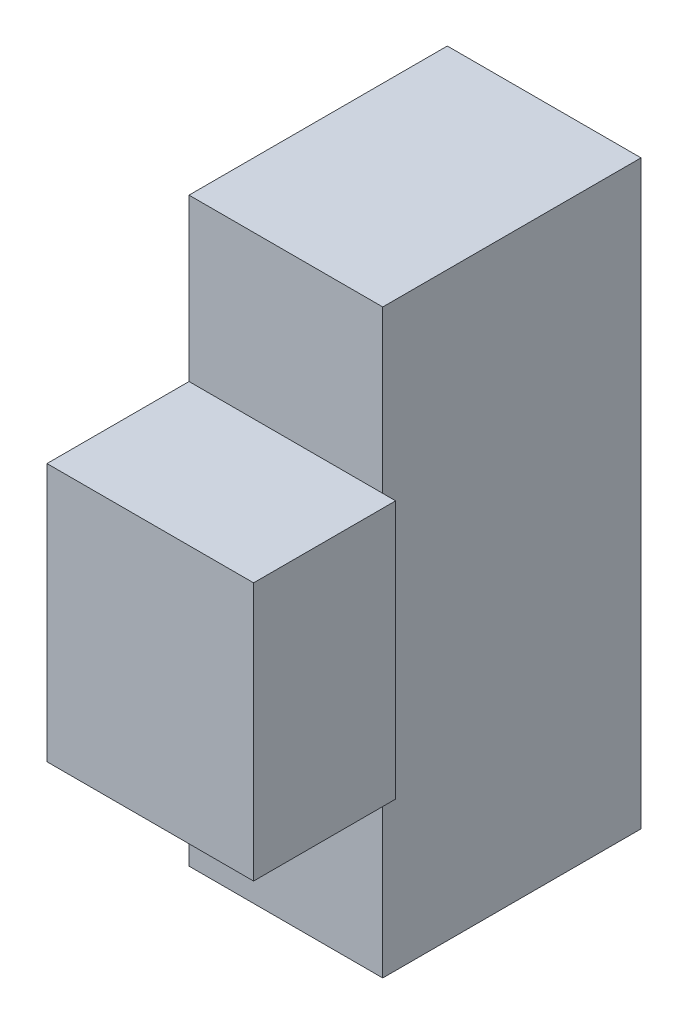
ISO-10303-21;
HEADER;
FILE_DESCRIPTION(('STEP AP214'),'2;1');
FILE_NAME('part.step','',(''),(''),'','','');
FILE_SCHEMA(('AUTOMOTIVE_DESIGN { 1 0 10303 214 1 1 1 1 }'));
ENDSEC;
DATA;
#1=APPLICATION_CONTEXT('core data for automotive mechanical design processes');
#2=APPLICATION_PROTOCOL_DEFINITION('international standard','automotive_design',2000,#1);
#3=PRODUCT_CONTEXT('',#1,'mechanical');
#4=PRODUCT('Part','Part','',(#3));
#5=PRODUCT_RELATED_PRODUCT_CATEGORY('part','',(#4));
#6=PRODUCT_DEFINITION_FORMATION('','',#4);
#7=PRODUCT_DEFINITION_CONTEXT('part definition',#1,'design');
#8=PRODUCT_DEFINITION('design','',#6,#7);
#9=PRODUCT_DEFINITION_SHAPE('','',#8);
#10=(LENGTH_UNIT() NAMED_UNIT(*) SI_UNIT(.MILLI.,.METRE.));
#11=(NAMED_UNIT(*) PLANE_ANGLE_UNIT() SI_UNIT($,.RADIAN.));
#12=(NAMED_UNIT(*) SI_UNIT($,.STERADIAN.) SOLID_ANGLE_UNIT());
#13=UNCERTAINTY_MEASURE_WITH_UNIT(LENGTH_MEASURE(1.E-05),#10,'distance_accuracy_value','');
#14=(GEOMETRIC_REPRESENTATION_CONTEXT(3) GLOBAL_UNCERTAINTY_ASSIGNED_CONTEXT((#13)) GLOBAL_UNIT_ASSIGNED_CONTEXT((#10,
#11,#12)) REPRESENTATION_CONTEXT('',''));
#15=CARTESIAN_POINT('',(0.,0.,0.));
#16=DIRECTION('',(0.,0.,1.));
#17=DIRECTION('',(1.,0.,0.));
#18=AXIS2_PLACEMENT_3D('',#15,#16,#17);
#19=CARTESIAN_POINT('',(0.,0.,0.));
#20=DIRECTION('',(1.,0.,0.));
#21=DIRECTION('',(0.,0.,-1.));
#22=AXIS2_PLACEMENT_3D('',#19,#20,#21);
#23=PLANE('',#22);
#24=DIRECTION('',(0.,0.,-1.));
#25=VECTOR('',#24,1.);
#26=CARTESIAN_POINT('',(0.,-22.5,20.));
#27=LINE('',#26,#25);
#28=CARTESIAN_POINT('',(0.,-22.5,20.));
#29=VERTEX_POINT('',#28);
#30=CARTESIAN_POINT('',(0.,-22.5,0.));
#31=VERTEX_POINT('',#30);
#32=EDGE_CURVE('E187',#29,#31,#27,.T.);
#33=ORIENTED_EDGE('',*,*,#32,.F.);
#34=DIRECTION('',(0.,-1.,0.));
#35=VECTOR('',#34,1.);
#36=CARTESIAN_POINT('',(0.,22.5,20.));
#37=LINE('',#36,#35);
#38=CARTESIAN_POINT('',(0.,-9.99999999999999,20.));
#39=VERTEX_POINT('',#38);
#40=EDGE_CURVE('E208',#39,#29,#37,.T.);
#41=ORIENTED_EDGE('',*,*,#40,.F.);
#42=DIRECTION('',(0.,0.,-1.));
#43=VECTOR('',#42,1.);
#44=CARTESIAN_POINT('',(0.,-10.,31.));
#45=LINE('',#44,#43);
#46=CARTESIAN_POINT('',(0.,-10.,31.));
#47=VERTEX_POINT('',#46);
#48=EDGE_CURVE('E65',#47,#39,#45,.T.);
#49=ORIENTED_EDGE('',*,*,#48,.F.);
#50=DIRECTION('',(0.,-1.,0.));
#51=VECTOR('',#50,1.);
#52=CARTESIAN_POINT('',(0.,10.,31.));
#53=LINE('',#52,#51);
#54=CARTESIAN_POINT('',(0.,10.,31.));
#55=VERTEX_POINT('',#54);
#56=EDGE_CURVE('E161',#55,#47,#53,.T.);
#57=ORIENTED_EDGE('',*,*,#56,.F.);
#58=DIRECTION('',(0.,0.,1.));
#59=VECTOR('',#58,1.);
#60=CARTESIAN_POINT('',(0.,10.,20.));
#61=LINE('',#60,#59);
#62=CARTESIAN_POINT('',(0.,10.,20.));
#63=VERTEX_POINT('',#62);
#64=EDGE_CURVE('E157',#63,#55,#61,.T.);
#65=ORIENTED_EDGE('',*,*,#64,.F.);
#66=CARTESIAN_POINT('',(0.,22.5,20.));
#67=VERTEX_POINT('',#66);
#68=EDGE_CURVE('E192',#67,#63,#37,.T.);
#69=ORIENTED_EDGE('',*,*,#68,.F.);
#70=DIRECTION('',(0.,0.,1.));
#71=VECTOR('',#70,1.);
#72=CARTESIAN_POINT('',(0.,22.5,0.));
#73=LINE('',#72,#71);
#74=CARTESIAN_POINT('',(0.,22.5,0.));
#75=VERTEX_POINT('',#74);
#76=EDGE_CURVE('E206',#75,#67,#73,.T.);
#77=ORIENTED_EDGE('',*,*,#76,.F.);
#78=DIRECTION('',(0.,1.,0.));
#79=VECTOR('',#78,1.);
#80=CARTESIAN_POINT('',(0.,-22.5,0.));
#81=LINE('',#80,#79);
#82=EDGE_CURVE('E204',#31,#75,#81,.T.);
#83=ORIENTED_EDGE('',*,*,#82,.F.);
#84=EDGE_LOOP('',(#33,#41,#49,#57,#65,#69,#77,#83));
#85=FACE_BOUND('',#84,.T.);
#86=CARTESIAN_POINT('',(0.,-13.1,9.99999999999998));
#87=DIRECTION('',(1.,0.,0.));
#88=DIRECTION('',(0.,0.,-1.));
#89=AXIS2_PLACEMENT_3D('',#86,#87,#88);
#90=CIRCLE('',#89,7.9);
#91=CARTESIAN_POINT('',(0.,-13.1,17.9));
#92=VERTEX_POINT('',#91);
#93=CARTESIAN_POINT('',(0.,-13.1,2.09999999999998));
#94=VERTEX_POINT('',#93);
#95=EDGE_CURVE('E57',#92,#94,#90,.T.);
#96=ORIENTED_EDGE('',*,*,#95,.T.);
#97=DIRECTION('',(0.,1.,0.));
#98=VECTOR('',#97,1.);
#99=CARTESIAN_POINT('',(0.,-13.1,2.09999999999998));
#100=LINE('',#99,#98);
#101=CARTESIAN_POINT('',(0.,13.1,2.09999999999998));
#102=VERTEX_POINT('',#101);
#103=EDGE_CURVE('E156',#94,#102,#100,.T.);
#104=ORIENTED_EDGE('',*,*,#103,.T.);
#105=CARTESIAN_POINT('',(0.,13.1,9.99999999999998));
#106=DIRECTION('',(1.,0.,0.));
#107=DIRECTION('',(0.,0.,-1.));
#108=AXIS2_PLACEMENT_3D('',#105,#106,#107);
#109=CIRCLE('',#108,7.9);
#110=CARTESIAN_POINT('',(0.,13.1,17.9));
#111=VERTEX_POINT('',#110);
#112=EDGE_CURVE('E406',#102,#111,#109,.T.);
#113=ORIENTED_EDGE('',*,*,#112,.T.);
#114=DIRECTION('',(0.,-1.,0.));
#115=VECTOR('',#114,1.);
#116=CARTESIAN_POINT('',(0.,13.1,17.9));
#117=LINE('',#116,#115);
#118=EDGE_CURVE('E152',#111,#92,#117,.T.);
#119=ORIENTED_EDGE('',*,*,#118,.T.);
#120=EDGE_LOOP('',(#96,#104,#113,#119));
#121=FACE_BOUND('',#120,.T.);
#122=ADVANCED_FACE('F39',(#85,#121),#23,.F.);
#123=CARTESIAN_POINT('',(15.,22.5,20.));
#124=DIRECTION('',(0.,0.,-1.));
#125=DIRECTION('',(-1.,0.,0.));
#126=AXIS2_PLACEMENT_3D('',#123,#124,#125);
#127=PLANE('',#126);
#128=DIRECTION('',(-1.,0.,0.));
#129=VECTOR('',#128,1.);
#130=CARTESIAN_POINT('',(16.,10.,20.));
#131=LINE('',#130,#129);
#132=CARTESIAN_POINT('',(15.,10.,20.));
#133=VERTEX_POINT('',#132);
#134=EDGE_CURVE('E11',#133,#63,#131,.T.);
#135=ORIENTED_EDGE('',*,*,#134,.F.);
#136=DIRECTION('',(0.,-1.,0.));
#137=VECTOR('',#136,1.);
#138=CARTESIAN_POINT('',(15.,22.5,20.));
#139=LINE('',#138,#137);
#140=CARTESIAN_POINT('',(15.,22.5,20.));
#141=VERTEX_POINT('',#140);
#142=EDGE_CURVE('E197',#141,#133,#139,.T.);
#143=ORIENTED_EDGE('',*,*,#142,.F.);
#144=DIRECTION('',(-1.,0.,0.));
#145=VECTOR('',#144,1.);
#146=CARTESIAN_POINT('',(15.,22.5,20.));
#147=LINE('',#146,#145);
#148=EDGE_CURVE('E213',#141,#67,#147,.T.);
#149=ORIENTED_EDGE('',*,*,#148,.T.);
#150=ORIENTED_EDGE('',*,*,#68,.T.);
#151=EDGE_LOOP('',(#135,#143,#149,#150));
#152=FACE_BOUND('',#151,.T.);
#153=ADVANCED_FACE('F250',(#152),#127,.F.);
#154=CARTESIAN_POINT('',(15.,-22.5,20.));
#155=DIRECTION('',(0.,1.,0.));
#156=DIRECTION('',(0.,0.,1.));
#157=AXIS2_PLACEMENT_3D('',#154,#155,#156);
#158=PLANE('',#157);
#159=ORIENTED_EDGE('',*,*,#32,.T.);
#160=DIRECTION('',(-1.,0.,0.));
#161=VECTOR('',#160,1.);
#162=CARTESIAN_POINT('',(15.,-22.5,0.));
#163=LINE('',#162,#161);
#164=CARTESIAN_POINT('',(15.,-22.5,0.));
#165=VERTEX_POINT('',#164);
#166=EDGE_CURVE('E43',#165,#31,#163,.T.);
#167=ORIENTED_EDGE('',*,*,#166,.F.);
#168=DIRECTION('',(0.,0.,-1.));
#169=VECTOR('',#168,1.);
#170=CARTESIAN_POINT('',(15.,-22.5,20.));
#171=LINE('',#170,#169);
#172=CARTESIAN_POINT('',(15.,-22.5,20.));
#173=VERTEX_POINT('',#172);
#174=EDGE_CURVE('E188',#173,#165,#171,.T.);
#175=ORIENTED_EDGE('',*,*,#174,.F.);
#176=DIRECTION('',(-1.,0.,0.));
#177=VECTOR('',#176,1.);
#178=CARTESIAN_POINT('',(15.,-22.5,20.));
#179=LINE('',#178,#177);
#180=EDGE_CURVE('E200',#173,#29,#179,.T.);
#181=ORIENTED_EDGE('',*,*,#180,.T.);
#182=EDGE_LOOP('',(#159,#167,#175,#181));
#183=FACE_BOUND('',#182,.T.);
#184=ADVANCED_FACE('F41',(#183),#158,.F.);
#185=CARTESIAN_POINT('',(15.,-22.5,0.));
#186=DIRECTION('',(0.,0.,1.));
#187=DIRECTION('',(0.,-1.,0.));
#188=AXIS2_PLACEMENT_3D('',#185,#186,#187);
#189=PLANE('',#188);
#190=ORIENTED_EDGE('',*,*,#82,.T.);
#191=DIRECTION('',(-1.,0.,0.));
#192=VECTOR('',#191,1.);
#193=CARTESIAN_POINT('',(15.,22.5,0.));
#194=LINE('',#193,#192);
#195=CARTESIAN_POINT('',(15.,22.5,0.));
#196=VERTEX_POINT('',#195);
#197=EDGE_CURVE('E215',#196,#75,#194,.T.);
#198=ORIENTED_EDGE('',*,*,#197,.F.);
#199=DIRECTION('',(0.,1.,0.));
#200=VECTOR('',#199,1.);
#201=CARTESIAN_POINT('',(15.,-22.5,0.));
#202=LINE('',#201,#200);
#203=EDGE_CURVE('E191',#165,#196,#202,.T.);
#204=ORIENTED_EDGE('',*,*,#203,.F.);
#205=ORIENTED_EDGE('',*,*,#166,.T.);
#206=EDGE_LOOP('',(#190,#198,#204,#205));
#207=FACE_BOUND('',#206,.T.);
#208=ADVANCED_FACE('F282',(#207),#189,.F.);
#209=CARTESIAN_POINT('',(15.,22.5,0.));
#210=DIRECTION('',(0.,-1.,0.));
#211=DIRECTION('',(0.,0.,-1.));
#212=AXIS2_PLACEMENT_3D('',#209,#210,#211);
#213=PLANE('',#212);
#214=ORIENTED_EDGE('',*,*,#76,.T.);
#215=ORIENTED_EDGE('',*,*,#148,.F.);
#216=DIRECTION('',(0.,0.,1.));
#217=VECTOR('',#216,1.);
#218=CARTESIAN_POINT('',(15.,22.5,0.));
#219=LINE('',#218,#217);
#220=EDGE_CURVE('E194',#196,#141,#219,.T.);
#221=ORIENTED_EDGE('',*,*,#220,.F.);
#222=ORIENTED_EDGE('',*,*,#197,.T.);
#223=EDGE_LOOP('',(#214,#215,#221,#222));
#224=FACE_BOUND('',#223,.T.);
#225=ADVANCED_FACE('F280',(#224),#213,.F.);
#226=CARTESIAN_POINT('',(15.,-10.,20.));
#227=VERTEX_POINT('',#226);
#228=EDGE_CURVE('E196',#227,#173,#139,.T.);
#229=ORIENTED_EDGE('',*,*,#228,.F.);
#230=DIRECTION('',(-1.,0.,0.));
#231=VECTOR('',#230,1.);
#232=CARTESIAN_POINT('',(16.,-10.,20.));
#233=LINE('',#232,#231);
#234=EDGE_CURVE('E48',#227,#39,#233,.T.);
#235=ORIENTED_EDGE('',*,*,#234,.T.);
#236=ORIENTED_EDGE('',*,*,#40,.T.);
#237=ORIENTED_EDGE('',*,*,#180,.F.);
#238=EDGE_LOOP('',(#229,#235,#236,#237));
#239=FACE_BOUND('',#238,.T.);
#240=ADVANCED_FACE('F227',(#239),#127,.F.);
#241=CARTESIAN_POINT('',(15.,0.,0.));
#242=DIRECTION('',(1.,0.,0.));
#243=DIRECTION('',(0.,0.,-1.));
#244=AXIS2_PLACEMENT_3D('',#241,#242,#243);
#245=PLANE('',#244);
#246=ORIENTED_EDGE('',*,*,#174,.T.);
#247=ORIENTED_EDGE('',*,*,#203,.T.);
#248=ORIENTED_EDGE('',*,*,#220,.T.);
#249=ORIENTED_EDGE('',*,*,#142,.T.);
#250=EDGE_CURVE('E201',#133,#227,#139,.T.);
#251=ORIENTED_EDGE('',*,*,#250,.T.);
#252=ORIENTED_EDGE('',*,*,#228,.T.);
#253=EDGE_LOOP('',(#246,#247,#248,#249,#251,#252));
#254=FACE_BOUND('',#253,.T.);
#255=ADVANCED_FACE('F237',(#254),#245,.T.);
#256=CARTESIAN_POINT('',(16.,10.,20.));
#257=DIRECTION('',(0.,-1.,0.));
#258=DIRECTION('',(0.,0.,-1.));
#259=AXIS2_PLACEMENT_3D('',#256,#257,#258);
#260=PLANE('',#259);
#261=ORIENTED_EDGE('',*,*,#64,.T.);
#262=DIRECTION('',(-1.,0.,0.));
#263=VECTOR('',#262,1.);
#264=CARTESIAN_POINT('',(16.,10.,31.));
#265=LINE('',#264,#263);
#266=CARTESIAN_POINT('',(16.,10.,31.));
#267=VERTEX_POINT('',#266);
#268=EDGE_CURVE('E184',#267,#55,#265,.T.);
#269=ORIENTED_EDGE('',*,*,#268,.F.);
#270=DIRECTION('',(0.,0.,1.));
#271=VECTOR('',#270,1.);
#272=CARTESIAN_POINT('',(16.,10.,20.));
#273=LINE('',#272,#271);
#274=CARTESIAN_POINT('',(16.,10.,20.));
#275=VERTEX_POINT('',#274);
#276=EDGE_CURVE('E167',#275,#267,#273,.T.);
#277=ORIENTED_EDGE('',*,*,#276,.F.);
#278=EDGE_CURVE('E50',#275,#133,#131,.T.);
#279=ORIENTED_EDGE('',*,*,#278,.T.);
#280=ORIENTED_EDGE('',*,*,#134,.T.);
#281=EDGE_LOOP('',(#261,#269,#277,#279,#280));
#282=FACE_BOUND('',#281,.T.);
#283=ADVANCED_FACE('F246',(#282),#260,.F.);
#284=CARTESIAN_POINT('',(16.,10.,31.));
#285=DIRECTION('',(0.,0.,-1.));
#286=DIRECTION('',(-1.,0.,0.));
#287=AXIS2_PLACEMENT_3D('',#284,#285,#286);
#288=PLANE('',#287);
#289=ORIENTED_EDGE('',*,*,#56,.T.);
#290=DIRECTION('',(-1.,0.,0.));
#291=VECTOR('',#290,1.);
#292=CARTESIAN_POINT('',(16.,-10.,31.));
#293=LINE('',#292,#291);
#294=CARTESIAN_POINT('',(16.,-10.,31.));
#295=VERTEX_POINT('',#294);
#296=EDGE_CURVE('E182',#295,#47,#293,.T.);
#297=ORIENTED_EDGE('',*,*,#296,.F.);
#298=DIRECTION('',(0.,-1.,0.));
#299=VECTOR('',#298,1.);
#300=CARTESIAN_POINT('',(16.,10.,31.));
#301=LINE('',#300,#299);
#302=EDGE_CURVE('E170',#267,#295,#301,.T.);
#303=ORIENTED_EDGE('',*,*,#302,.F.);
#304=ORIENTED_EDGE('',*,*,#268,.T.);
#305=EDGE_LOOP('',(#289,#297,#303,#304));
#306=FACE_BOUND('',#305,.T.);
#307=ADVANCED_FACE('F254',(#306),#288,.F.);
#308=CARTESIAN_POINT('',(16.,-10.,31.));
#309=DIRECTION('',(0.,1.,0.));
#310=DIRECTION('',(0.,0.,1.));
#311=AXIS2_PLACEMENT_3D('',#308,#309,#310);
#312=PLANE('',#311);
#313=ORIENTED_EDGE('',*,*,#48,.T.);
#314=ORIENTED_EDGE('',*,*,#234,.F.);
#315=CARTESIAN_POINT('',(16.,-10.,20.));
#316=VERTEX_POINT('',#315);
#317=EDGE_CURVE('E179',#316,#227,#233,.T.);
#318=ORIENTED_EDGE('',*,*,#317,.F.);
#319=DIRECTION('',(0.,0.,-1.));
#320=VECTOR('',#319,1.);
#321=CARTESIAN_POINT('',(16.,-10.,31.));
#322=LINE('',#321,#320);
#323=EDGE_CURVE('E172',#295,#316,#322,.T.);
#324=ORIENTED_EDGE('',*,*,#323,.F.);
#325=ORIENTED_EDGE('',*,*,#296,.T.);
#326=EDGE_LOOP('',(#313,#314,#318,#324,#325));
#327=FACE_BOUND('',#326,.T.);
#328=ADVANCED_FACE('F259',(#327),#312,.F.);
#329=CARTESIAN_POINT('',(16.,-10.,20.));
#330=DIRECTION('',(0.,0.,1.));
#331=DIRECTION('',(1.,0.,0.));
#332=AXIS2_PLACEMENT_3D('',#329,#330,#331);
#333=PLANE('',#332);
#334=ORIENTED_EDGE('',*,*,#250,.F.);
#335=ORIENTED_EDGE('',*,*,#278,.F.);
#336=DIRECTION('',(0.,1.,0.));
#337=VECTOR('',#336,1.);
#338=CARTESIAN_POINT('',(16.,-10.,20.));
#339=LINE('',#338,#337);
#340=EDGE_CURVE('E174',#316,#275,#339,.T.);
#341=ORIENTED_EDGE('',*,*,#340,.F.);
#342=ORIENTED_EDGE('',*,*,#317,.T.);
#343=EDGE_LOOP('',(#334,#335,#341,#342));
#344=FACE_BOUND('',#343,.T.);
#345=ADVANCED_FACE('F241',(#344),#333,.F.);
#346=CARTESIAN_POINT('',(16.,0.,0.));
#347=DIRECTION('',(1.,0.,0.));
#348=DIRECTION('',(0.,0.,-1.));
#349=AXIS2_PLACEMENT_3D('',#346,#347,#348);
#350=PLANE('',#349);
#351=ORIENTED_EDGE('',*,*,#276,.T.);
#352=ORIENTED_EDGE('',*,*,#302,.T.);
#353=ORIENTED_EDGE('',*,*,#323,.T.);
#354=ORIENTED_EDGE('',*,*,#340,.T.);
#355=EDGE_LOOP('',(#351,#352,#353,#354));
#356=FACE_BOUND('',#355,.T.);
#357=ADVANCED_FACE('F258',(#356),#350,.T.);
#358=CARTESIAN_POINT('',(11.4,-13.1,9.99999999999998));
#359=DIRECTION('',(-1.,0.,0.));
#360=DIRECTION('',(0.,0.,1.));
#361=AXIS2_PLACEMENT_3D('',#358,#359,#360);
#362=CYLINDRICAL_SURFACE('',#361,7.9);
#363=ORIENTED_EDGE('',*,*,#95,.F.);
#364=DIRECTION('',(-1.,0.,0.));
#365=VECTOR('',#364,1.);
#366=CARTESIAN_POINT('',(11.4,-13.1,17.9));
#367=LINE('',#366,#365);
#368=CARTESIAN_POINT('',(11.4,-13.1,17.9));
#369=VERTEX_POINT('',#368);
#370=EDGE_CURVE('E151',#369,#92,#367,.T.);
#371=ORIENTED_EDGE('',*,*,#370,.F.);
#372=CARTESIAN_POINT('',(11.4,-13.1,9.99999999999998));
#373=DIRECTION('',(1.,0.,0.));
#374=DIRECTION('',(0.,0.,-1.));
#375=AXIS2_PLACEMENT_3D('',#372,#373,#374);
#376=CIRCLE('',#375,7.9);
#377=CARTESIAN_POINT('',(11.4,-13.1,2.09999999999998));
#378=VERTEX_POINT('',#377);
#379=EDGE_CURVE('E143',#369,#378,#376,.T.);
#380=ORIENTED_EDGE('',*,*,#379,.T.);
#381=DIRECTION('',(-1.,0.,0.));
#382=VECTOR('',#381,1.);
#383=CARTESIAN_POINT('',(11.4,-13.1,2.09999999999998));
#384=LINE('',#383,#382);
#385=EDGE_CURVE('E150',#378,#94,#384,.T.);
#386=ORIENTED_EDGE('',*,*,#385,.T.);
#387=EDGE_LOOP('',(#363,#371,#380,#386));
#388=FACE_BOUND('',#387,.T.);
#389=ADVANCED_FACE('F149',(#388),#362,.F.);
#390=CARTESIAN_POINT('',(11.4,-13.1,2.09999999999998));
#391=DIRECTION('',(0.,0.,1.));
#392=DIRECTION('',(0.,-1.,0.));
#393=AXIS2_PLACEMENT_3D('',#390,#391,#392);
#394=PLANE('',#393);
#395=ORIENTED_EDGE('',*,*,#103,.F.);
#396=ORIENTED_EDGE('',*,*,#385,.F.);
#397=DIRECTION('',(0.,1.,0.));
#398=VECTOR('',#397,1.);
#399=CARTESIAN_POINT('',(11.4,-13.1,2.09999999999998));
#400=LINE('',#399,#398);
#401=CARTESIAN_POINT('',(11.4,13.1,2.09999999999998));
#402=VERTEX_POINT('',#401);
#403=EDGE_CURVE('E139',#378,#402,#400,.T.);
#404=ORIENTED_EDGE('',*,*,#403,.T.);
#405=DIRECTION('',(-1.,0.,0.));
#406=VECTOR('',#405,1.);
#407=CARTESIAN_POINT('',(11.4,13.1,2.09999999999998));
#408=LINE('',#407,#406);
#409=EDGE_CURVE('E158',#402,#102,#408,.T.);
#410=ORIENTED_EDGE('',*,*,#409,.T.);
#411=EDGE_LOOP('',(#395,#396,#404,#410));
#412=FACE_BOUND('',#411,.T.);
#413=ADVANCED_FACE('F154',(#412),#394,.T.);
#414=CARTESIAN_POINT('',(11.4,13.1,9.99999999999998));
#415=DIRECTION('',(-1.,0.,0.));
#416=DIRECTION('',(0.,0.,1.));
#417=AXIS2_PLACEMENT_3D('',#414,#415,#416);
#418=CYLINDRICAL_SURFACE('',#417,7.9);
#419=ORIENTED_EDGE('',*,*,#112,.F.);
#420=ORIENTED_EDGE('',*,*,#409,.F.);
#421=CARTESIAN_POINT('',(11.4,13.1,9.99999999999998));
#422=DIRECTION('',(1.,0.,0.));
#423=DIRECTION('',(0.,0.,-1.));
#424=AXIS2_PLACEMENT_3D('',#421,#422,#423);
#425=CIRCLE('',#424,7.9);
#426=CARTESIAN_POINT('',(11.4,13.1,17.9));
#427=VERTEX_POINT('',#426);
#428=EDGE_CURVE('E144',#402,#427,#425,.T.);
#429=ORIENTED_EDGE('',*,*,#428,.T.);
#430=DIRECTION('',(-1.,0.,0.));
#431=VECTOR('',#430,1.);
#432=CARTESIAN_POINT('',(11.4,13.1,17.9));
#433=LINE('',#432,#431);
#434=EDGE_CURVE('E163',#427,#111,#433,.T.);
#435=ORIENTED_EDGE('',*,*,#434,.T.);
#436=EDGE_LOOP('',(#419,#420,#429,#435));
#437=FACE_BOUND('',#436,.T.);
#438=ADVANCED_FACE('F372',(#437),#418,.F.);
#439=CARTESIAN_POINT('',(11.4,13.1,17.9));
#440=DIRECTION('',(0.,0.,-1.));
#441=DIRECTION('',(0.,1.,0.));
#442=AXIS2_PLACEMENT_3D('',#439,#440,#441);
#443=PLANE('',#442);
#444=ORIENTED_EDGE('',*,*,#118,.F.);
#445=ORIENTED_EDGE('',*,*,#434,.F.);
#446=DIRECTION('',(0.,-1.,0.));
#447=VECTOR('',#446,1.);
#448=CARTESIAN_POINT('',(11.4,13.1,17.9));
#449=LINE('',#448,#447);
#450=EDGE_CURVE('E413',#427,#369,#449,.T.);
#451=ORIENTED_EDGE('',*,*,#450,.T.);
#452=ORIENTED_EDGE('',*,*,#370,.T.);
#453=EDGE_LOOP('',(#444,#445,#451,#452));
#454=FACE_BOUND('',#453,.T.);
#455=ADVANCED_FACE('F381',(#454),#443,.T.);
#456=CARTESIAN_POINT('',(11.4,-13.1,9.99999999999998));
#457=DIRECTION('',(1.,0.,0.));
#458=DIRECTION('',(0.,0.,-1.));
#459=AXIS2_PLACEMENT_3D('',#456,#457,#458);
#460=PLANE('',#459);
#461=ORIENTED_EDGE('',*,*,#379,.F.);
#462=ORIENTED_EDGE('',*,*,#450,.F.);
#463=ORIENTED_EDGE('',*,*,#428,.F.);
#464=ORIENTED_EDGE('',*,*,#403,.F.);
#465=EDGE_LOOP('',(#461,#462,#463,#464));
#466=FACE_BOUND('',#465,.T.);
#467=ADVANCED_FACE('F141',(#466),#460,.F.);
#468=CLOSED_SHELL('',(#122,#153,#184,#208,#225,#240,#255,#283,#307,#328,#345,#357,#389,#413,
#438,#455,#467));
#469=MANIFOLD_SOLID_BREP('B2',#468);
#470=ADVANCED_BREP_SHAPE_REPRESENTATION('',(#18,#469),#14);
#471=SHAPE_DEFINITION_REPRESENTATION(#9,#470);
ENDSEC;
END-ISO-10303-21;
